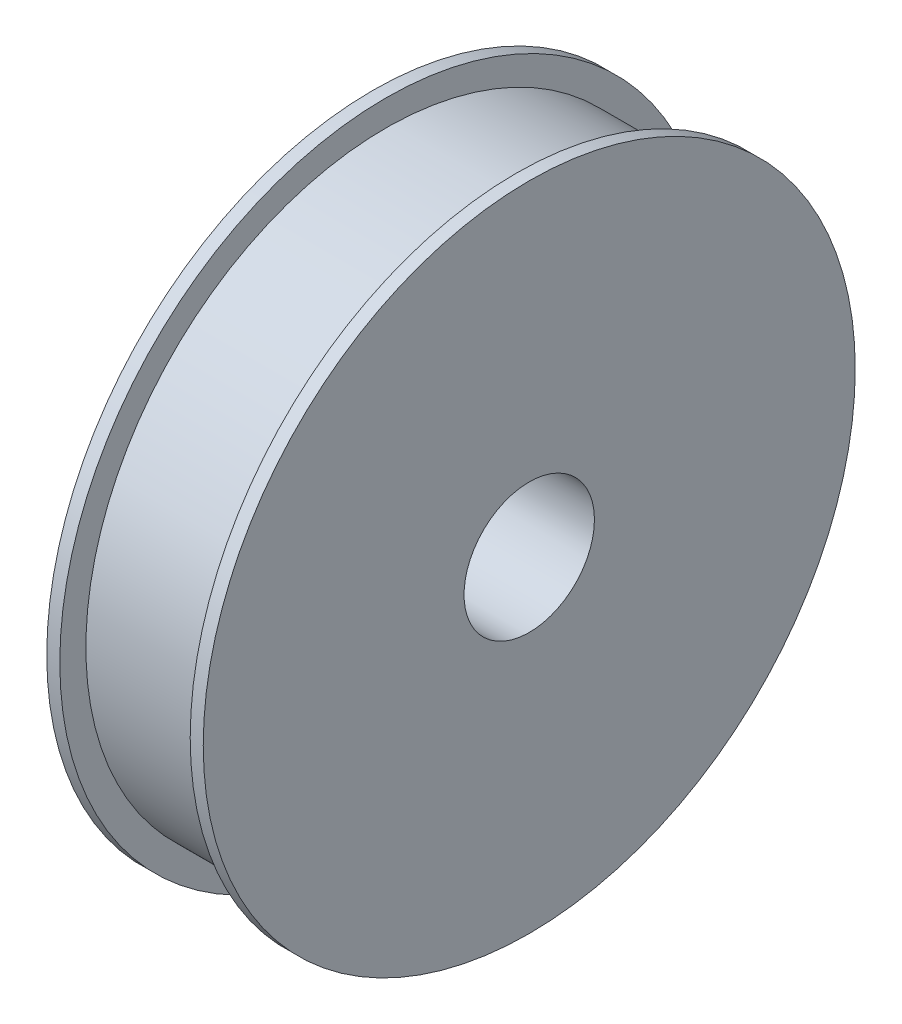
ISO-10303-21;
HEADER;
FILE_DESCRIPTION(('STEP AP214'),'2;1');
FILE_NAME('part.step','',(''),(''),'','','');
FILE_SCHEMA(('AUTOMOTIVE_DESIGN { 1 0 10303 214 1 1 1 1 }'));
ENDSEC;
DATA;
#1=APPLICATION_CONTEXT('core data for automotive mechanical design processes');
#2=APPLICATION_PROTOCOL_DEFINITION('international standard','automotive_design',2000,#1);
#3=PRODUCT_CONTEXT('',#1,'mechanical');
#4=PRODUCT('Part','Part','',(#3));
#5=PRODUCT_RELATED_PRODUCT_CATEGORY('part','',(#4));
#6=PRODUCT_DEFINITION_FORMATION('','',#4);
#7=PRODUCT_DEFINITION_CONTEXT('part definition',#1,'design');
#8=PRODUCT_DEFINITION('design','',#6,#7);
#9=PRODUCT_DEFINITION_SHAPE('','',#8);
#10=(LENGTH_UNIT() NAMED_UNIT(*) SI_UNIT(.MILLI.,.METRE.));
#11=(NAMED_UNIT(*) PLANE_ANGLE_UNIT() SI_UNIT($,.RADIAN.));
#12=(NAMED_UNIT(*) SI_UNIT($,.STERADIAN.) SOLID_ANGLE_UNIT());
#13=UNCERTAINTY_MEASURE_WITH_UNIT(LENGTH_MEASURE(1.E-05),#10,'distance_accuracy_value','');
#14=(GEOMETRIC_REPRESENTATION_CONTEXT(3) GLOBAL_UNCERTAINTY_ASSIGNED_CONTEXT((#13)) GLOBAL_UNIT_ASSIGNED_CONTEXT((#10,
#11,#12)) REPRESENTATION_CONTEXT('',''));
#15=CARTESIAN_POINT('',(0.,0.,0.));
#16=DIRECTION('',(0.,0.,1.));
#17=DIRECTION('',(1.,0.,0.));
#18=AXIS2_PLACEMENT_3D('',#15,#16,#17);
#19=CARTESIAN_POINT('',(18.,0.,0.));
#20=DIRECTION('',(1.,0.,0.));
#21=DIRECTION('',(0.,0.,-1.));
#22=AXIS2_PLACEMENT_3D('',#19,#20,#21);
#23=CYLINDRICAL_SURFACE('',#22,25.);
#24=CARTESIAN_POINT('',(6.,0.,0.));
#25=DIRECTION('',(1.,0.,0.));
#26=DIRECTION('',(0.,0.,-1.));
#27=AXIS2_PLACEMENT_3D('',#24,#25,#26);
#28=CIRCLE('',#27,25.);
#29=CARTESIAN_POINT('',(6.,0.,-25.));
#30=VERTEX_POINT('',#29);
#31=EDGE_CURVE('E172',#30,#30,#28,.F.);
#32=ORIENTED_EDGE('',*,*,#31,.F.);
#33=EDGE_LOOP('',(#32));
#34=FACE_BOUND('',#33,.T.);
#35=CARTESIAN_POINT('',(7.,0.,0.));
#36=DIRECTION('',(1.,0.,0.));
#37=DIRECTION('',(0.,0.,-1.));
#38=AXIS2_PLACEMENT_3D('',#35,#36,#37);
#39=CIRCLE('',#38,25.);
#40=CARTESIAN_POINT('',(7.,0.,-25.));
#41=VERTEX_POINT('',#40);
#42=EDGE_CURVE('E18',#41,#41,#39,.T.);
#43=ORIENTED_EDGE('',*,*,#42,.F.);
#44=EDGE_LOOP('',(#43));
#45=FACE_BOUND('',#44,.T.);
#46=ADVANCED_FACE('F15',(#34,#45),#23,.T.);
#47=CARTESIAN_POINT('',(7.,25.,0.));
#48=DIRECTION('',(1.,0.,0.));
#49=DIRECTION('',(0.,0.,-1.));
#50=AXIS2_PLACEMENT_3D('',#47,#48,#49);
#51=PLANE('',#50);
#52=CARTESIAN_POINT('',(7.,0.,0.));
#53=DIRECTION('',(1.,0.,0.));
#54=DIRECTION('',(0.,0.,-1.));
#55=AXIS2_PLACEMENT_3D('',#52,#53,#54);
#56=CIRCLE('',#55,23.);
#57=CARTESIAN_POINT('',(7.,0.,-23.));
#58=VERTEX_POINT('',#57);
#59=EDGE_CURVE('E176',#58,#58,#56,.T.);
#60=ORIENTED_EDGE('',*,*,#59,.F.);
#61=EDGE_LOOP('',(#60));
#62=FACE_BOUND('',#61,.T.);
#63=ORIENTED_EDGE('',*,*,#42,.T.);
#64=EDGE_LOOP('',(#63));
#65=FACE_BOUND('',#64,.T.);
#66=ADVANCED_FACE('F146',(#62,#65),#51,.T.);
#67=CARTESIAN_POINT('',(6.,10.,0.));
#68=DIRECTION('',(-1.,0.,0.));
#69=DIRECTION('',(0.,0.,1.));
#70=AXIS2_PLACEMENT_3D('',#67,#68,#69);
#71=PLANE('',#70);
#72=ORIENTED_EDGE('',*,*,#31,.T.);
#73=EDGE_LOOP('',(#72));
#74=FACE_BOUND('',#73,.T.);
#75=CARTESIAN_POINT('',(6.,0.,0.));
#76=DIRECTION('',(1.,0.,0.));
#77=DIRECTION('',(0.,0.,-1.));
#78=AXIS2_PLACEMENT_3D('',#75,#76,#77);
#79=CIRCLE('',#78,10.);
#80=CARTESIAN_POINT('',(6.,0.,-10.));
#81=VERTEX_POINT('',#80);
#82=EDGE_CURVE('E178',#81,#81,#79,.F.);
#83=ORIENTED_EDGE('',*,*,#82,.F.);
#84=EDGE_LOOP('',(#83));
#85=FACE_BOUND('',#84,.T.);
#86=ADVANCED_FACE('F136',(#74,#85),#71,.T.);
#87=CARTESIAN_POINT('',(18.,0.,0.));
#88=DIRECTION('',(1.,0.,0.));
#89=DIRECTION('',(0.,0.,-1.));
#90=AXIS2_PLACEMENT_3D('',#87,#88,#89);
#91=CYLINDRICAL_SURFACE('',#90,23.);
#92=ORIENTED_EDGE('',*,*,#59,.T.);
#93=EDGE_LOOP('',(#92));
#94=FACE_BOUND('',#93,.T.);
#95=CARTESIAN_POINT('',(17.,0.,0.));
#96=DIRECTION('',(1.,0.,0.));
#97=DIRECTION('',(0.,0.,-1.));
#98=AXIS2_PLACEMENT_3D('',#95,#96,#97);
#99=CIRCLE('',#98,23.);
#100=CARTESIAN_POINT('',(17.,0.,-23.));
#101=VERTEX_POINT('',#100);
#102=EDGE_CURVE('E183',#101,#101,#99,.T.);
#103=ORIENTED_EDGE('',*,*,#102,.F.);
#104=EDGE_LOOP('',(#103));
#105=FACE_BOUND('',#104,.T.);
#106=ADVANCED_FACE('F126',(#94,#105),#91,.T.);
#107=CARTESIAN_POINT('',(18.,0.,0.));
#108=DIRECTION('',(1.,0.,0.));
#109=DIRECTION('',(0.,0.,-1.));
#110=AXIS2_PLACEMENT_3D('',#107,#108,#109);
#111=CYLINDRICAL_SURFACE('',#110,10.);
#112=CARTESIAN_POINT('',(0.,0.,0.));
#113=DIRECTION('',(1.,0.,0.));
#114=DIRECTION('',(0.,0.,-1.));
#115=AXIS2_PLACEMENT_3D('',#112,#113,#114);
#116=CIRCLE('',#115,10.);
#117=CARTESIAN_POINT('',(0.,0.,-10.));
#118=VERTEX_POINT('',#117);
#119=EDGE_CURVE('E200',#118,#118,#116,.F.);
#120=ORIENTED_EDGE('',*,*,#119,.F.);
#121=EDGE_LOOP('',(#120));
#122=FACE_BOUND('',#121,.T.);
#123=CARTESIAN_POINT('',(3.,-7.6107094426595,-6.48668650232255));
#124=CARTESIAN_POINT('',(3.09191207261619,-7.61070737338895,-6.4866906171636));
#125=CARTESIAN_POINT('',(3.18394162874946,-7.60564328536761,-6.4926451064222));
#126=CARTESIAN_POINT('',(3.36548829058131,-7.58544728393344,-6.51622753022773));
#127=CARTESIAN_POINT('',(3.45499989813022,-7.57029488885876,-6.53387921251496));
#128=CARTESIAN_POINT('',(3.62875467587054,-7.5301845404463,-6.58006455054326));
#129=CARTESIAN_POINT('',(3.71300429845787,-7.50523888082746,-6.60858456170092));
#130=CARTESIAN_POINT('',(3.87399077064178,-7.445965963636,-6.67529565854484));
#131=CARTESIAN_POINT('',(3.95073040588339,-7.41164220269025,-6.71348313932422));
#132=CARTESIAN_POINT('',(4.0953054129355,-7.33384171773215,-6.79838956733881));
#133=CARTESIAN_POINT('',(4.16305697579763,-7.29028751545858,-6.8451802574938));
#134=CARTESIAN_POINT('',(4.28700631581203,-7.19498402307885,-6.94528414584731));
#135=CARTESIAN_POINT('',(4.34320281752596,-7.14323382942057,-6.99859806303954));
#136=CARTESIAN_POINT('',(4.4427518873531,-7.03222709351986,-7.1101335496477));
#137=CARTESIAN_POINT('',(4.48602772405625,-6.97292857825665,-7.16838189993056));
#138=CARTESIAN_POINT('',(4.55801334192307,-6.84838147828735,-7.28746080548884));
#139=CARTESIAN_POINT('',(4.586724177543,-6.78313332471831,-7.34829117348937));
#140=CARTESIAN_POINT('',(4.62851232822919,-6.64892307695652,-7.46993616875164));
#141=CARTESIAN_POINT('',(4.64172872738852,-6.57999992243994,-7.5307459597381));
#142=CARTESIAN_POINT('',(4.65258525618147,-6.43977884563567,-7.65099836793383));
#143=CARTESIAN_POINT('',(4.65022639848113,-6.36848107803957,-7.71044107377554));
#144=CARTESIAN_POINT('',(4.63010801514252,-6.22629528468234,-7.825697735011));
#145=CARTESIAN_POINT('',(4.61249829951111,-6.15541000554826,-7.88154132861692));
#146=CARTESIAN_POINT('',(4.56261364034299,-6.0155020463048,-7.98883673327135));
#147=CARTESIAN_POINT('',(4.53033813693551,-5.94647943740998,-8.04028837656678));
#148=CARTESIAN_POINT('',(4.45188752153465,-5.81215880976353,-8.13792001561393));
#149=CARTESIAN_POINT('',(4.40565009258496,-5.74687908430345,-8.1840750690429));
#150=CARTESIAN_POINT('',(4.30063758144345,-5.622509921932,-8.27001237542387));
#151=CARTESIAN_POINT('',(4.24186247305361,-5.56342049795591,-8.30979461505929));
#152=CARTESIAN_POINT('',(4.11262333918614,-5.45277253183398,-8.38282327229497));
#153=CARTESIAN_POINT('',(4.04203051717762,-5.40131026056838,-8.41598771566978));
#154=CARTESIAN_POINT('',(3.89155348222626,-5.3085889760726,-8.47478072010684));
#155=CARTESIAN_POINT('',(3.81166510849771,-5.2673345580152,-8.50040588826254));
#156=CARTESIAN_POINT('',(3.64469791953155,-5.19656277533974,-8.54385568654615));
#157=CARTESIAN_POINT('',(3.55760585891,-5.16706763895386,-8.56166554996228));
#158=CARTESIAN_POINT('',(3.37894726411673,-5.12116304157553,-8.5892035071003));
#159=CARTESIAN_POINT('',(3.28739062079285,-5.10472593529375,-8.59894867650401));
#160=CARTESIAN_POINT('',(3.16264363685023,-5.09176988820861,-8.60661881044247));
#161=CARTESIAN_POINT('',(3.13018823400373,-5.08924858698144,-8.60810970880728));
#162=CARTESIAN_POINT('',(3.06516014363887,-5.08588278463216,-8.61009872226581));
#163=CARTESIAN_POINT('',(3.03258745600735,-5.08503828512821,-8.61059683640146));
#164=CARTESIAN_POINT('',(2.90808792738381,-5.08504425707382,-8.61059503110882));
#165=CARTESIAN_POINT('',(2.81605837125054,-5.09177915651973,-8.60662740470603));
#166=CARTESIAN_POINT('',(2.63451170941869,-5.11847635989702,-8.59077595309099));
#167=CARTESIAN_POINT('',(2.54500010186978,-5.13846557289866,-8.57887602335827));
#168=CARTESIAN_POINT('',(2.37124532412946,-5.19084667476252,-8.54728257995484));
#169=CARTESIAN_POINT('',(2.28699570154213,-5.22322301248004,-8.52759883726568));
#170=CARTESIAN_POINT('',(2.12600922935822,-5.2991126887766,-8.48064773306026));
#171=CARTESIAN_POINT('',(2.04926959411661,-5.34262187608732,-8.45338319797719));
#172=CARTESIAN_POINT('',(1.9046945870645,-5.4396153158594,-8.3913002726346));
#173=CARTESIAN_POINT('',(1.83694302420237,-5.49318353808838,-8.35641785889797));
#174=CARTESIAN_POINT('',(1.71299368418797,-5.60815155701611,-8.27969824766916));
#175=CARTESIAN_POINT('',(1.65679718247404,-5.6695522170423,-8.23786028334968));
#176=CARTESIAN_POINT('',(1.5572481126469,-5.79847604829583,-8.14763109780997));
#177=CARTESIAN_POINT('',(1.51397227594375,-5.86603280327888,-8.09920311954063));
#178=CARTESIAN_POINT('',(1.44198665807693,-6.00471088883833,-7.99692822308364));
#179=CARTESIAN_POINT('',(1.413275822457,-6.07583196096062,-7.94308169751862));
#180=CARTESIAN_POINT('',(1.37148767177081,-6.2186956677781,-7.83172705347083));
#181=CARTESIAN_POINT('',(1.35827127261148,-6.29042685837201,-7.7742564679134));
#182=CARTESIAN_POINT('',(1.34741474381853,-6.43294968522202,-7.6567412098245));
#183=CARTESIAN_POINT('',(1.34977360151887,-6.50374138226187,-7.59669670489532));
#184=CARTESIAN_POINT('',(1.36989198485748,-6.64167952602322,-7.47638890677965));
#185=CARTESIAN_POINT('',(1.38750170048889,-6.70885470051914,-7.4161334034942));
#186=CARTESIAN_POINT('',(1.43738635965701,-6.83855886115174,-7.2967040451512));
#187=CARTESIAN_POINT('',(1.46966186306449,-6.901087669806,-7.23753023147719));
#188=CARTESIAN_POINT('',(1.54811247846535,-7.02031287882677,-7.12194771771182));
#189=CARTESIAN_POINT('',(1.59434990741504,-7.07698156862824,-7.06555276129407));
#190=CARTESIAN_POINT('',(1.69936241855655,-7.18297875518455,-6.95776822799202));
#191=CARTESIAN_POINT('',(1.75813752694639,-7.23230723660133,-6.90637866156703));
#192=CARTESIAN_POINT('',(1.88737666081386,-7.32323344274595,-6.8098976674764));
#193=CARTESIAN_POINT('',(1.95796948282238,-7.36473389446037,-6.76488702233913));
#194=CARTESIAN_POINT('',(2.10844651777374,-7.4385603982766,-6.6836250921162));
#195=CARTESIAN_POINT('',(2.18833489150229,-7.47088231952931,-6.64737775209247));
#196=CARTESIAN_POINT('',(2.35530208046845,-7.52582793015333,-6.58510809602225));
#197=CARTESIAN_POINT('',(2.44239414109,-7.54843325876909,-6.55910514573778));
#198=CARTESIAN_POINT('',(2.62105273588327,-7.58343728527461,-6.51860466089868));
#199=CARTESIAN_POINT('',(2.71260937920715,-7.59585754788028,-6.50408281988482));
#200=CARTESIAN_POINT('',(2.83735636314977,-7.60563640832542,-6.49263450127026));
#201=CARTESIAN_POINT('',(2.86981176599627,-7.60753769955203,-6.49040631153778));
#202=CARTESIAN_POINT('',(2.93483985636113,-7.61007458416007,-6.48743158188987));
#203=CARTESIAN_POINT('',(2.96741254399265,-7.61071017632007,-6.48668504340428));
#204=CARTESIAN_POINT('',(3.,-7.6107094426595,-6.48668650232255));
#205=B_SPLINE_CURVE_WITH_KNOTS('',3,(#123,#124,#125,#126,#127,#128,#129,#130,#131,#132,#133,
#134,#135,#136,#137,#138,#139,#140,#141,#142,#143,#144,#145,#146,#147,#148,#149,#150,#151,#152,
#153,#154,#155,#156,#157,#158,#159,#160,#161,#162,#163,#164,#165,#166,#167,#168,#169,#170,#171,
#172,#173,#174,#175,#176,#177,#178,#179,#180,#181,#182,#183,#184,#185,#186,#187,#188,#189,#190,
#191,#192,#193,#194,#195,#196,#197,#198,#199,#200,#201,#202,#203,#204),.UNSPECIFIED.,.T.,.F.,(4,
2,2,2,2,2,2,2,2,2,2,2,2,2,2,2,2,2,2,2,2,2,2,2,2,2,2,2,2,2,2,2,2,2,2,2,2,2,2,2,4),(0.,
0.275611787158917,0.551784845046081,0.827612319197246,1.10333709103337,1.38147502679861,
1.65964364674415,1.93943277847992,2.21920165154795,2.49643950072986,2.77365932474558,
3.04818649863057,3.32272415355211,3.59850574755901,3.87428791782914,4.15329893025649,
4.43243531486017,4.71209686930941,4.99116475970074,5.08888291648003,5.18660116755956,
5.46221295471848,5.73838601260565,6.01421348675681,6.28993825859293,6.56807619435817,
6.84624481430371,7.12603394603949,7.40580281910751,7.68304066828942,7.96026049230514,
8.23478766619013,8.50932532111167,8.78510691511857,9.0608890853887,9.33990009781605,
9.61903648241973,9.89869803686897,10.1777659272603,10.2754840840396,10.3732023351191),.UNSPECIFIED.);
#206=CARTESIAN_POINT('',(3.,-7.6107094426595,-6.48668650232255));
#207=VERTEX_POINT('',#206);
#208=EDGE_CURVE('E191',#207,#207,#205,.T.);
#209=ORIENTED_EDGE('',*,*,#208,.T.);
#210=EDGE_LOOP('',(#209));
#211=FACE_BOUND('',#210,.T.);
#212=ORIENTED_EDGE('',*,*,#82,.T.);
#213=EDGE_LOOP('',(#212));
#214=FACE_BOUND('',#213,.T.);
#215=CARTESIAN_POINT('',(3.,5.08503984827079,8.6105963638704));
#216=CARTESIAN_POINT('',(2.90808792738381,5.08504425707382,8.61059503110882));
#217=CARTESIAN_POINT('',(2.81605837125054,5.09177915651973,8.60662740470603));
#218=CARTESIAN_POINT('',(2.63451170941869,5.11847635989702,8.59077595309099));
#219=CARTESIAN_POINT('',(2.54500010186978,5.13846557289866,8.57887602335827));
#220=CARTESIAN_POINT('',(2.37124532412946,5.19084667476251,8.54728257995484));
#221=CARTESIAN_POINT('',(2.28699570154213,5.22322301248003,8.52759883726568));
#222=CARTESIAN_POINT('',(2.12600922935822,5.2991126887766,8.48064773306026));
#223=CARTESIAN_POINT('',(2.04926959411661,5.34262187608732,8.45338319797719));
#224=CARTESIAN_POINT('',(1.9046945870645,5.4396153158594,8.3913002726346));
#225=CARTESIAN_POINT('',(1.83694302420237,5.49318353808838,8.35641785889797));
#226=CARTESIAN_POINT('',(1.71299368418797,5.60815155701611,8.27969824766916));
#227=CARTESIAN_POINT('',(1.65679718247404,5.6695522170423,8.23786028334968));
#228=CARTESIAN_POINT('',(1.5572481126469,5.79847604829583,8.14763109780997));
#229=CARTESIAN_POINT('',(1.51397227594375,5.86603280327888,8.09920311954063));
#230=CARTESIAN_POINT('',(1.44198665807693,6.00471088883833,7.99692822308364));
#231=CARTESIAN_POINT('',(1.413275822457,6.07583196096062,7.94308169751862));
#232=CARTESIAN_POINT('',(1.37148767177081,6.2186956677781,7.83172705347084));
#233=CARTESIAN_POINT('',(1.35827127261148,6.29042685837201,7.7742564679134));
#234=CARTESIAN_POINT('',(1.34741474381853,6.43294968522202,7.6567412098245));
#235=CARTESIAN_POINT('',(1.34977360151887,6.50374138226187,7.59669670489532));
#236=CARTESIAN_POINT('',(1.36989198485749,6.64167952602322,7.47638890677965));
#237=CARTESIAN_POINT('',(1.3875017004889,6.70885470051913,7.4161334034942));
#238=CARTESIAN_POINT('',(1.43738635965701,6.83855886115174,7.2967040451512));
#239=CARTESIAN_POINT('',(1.46966186306449,6.90108766980599,7.23753023147719));
#240=CARTESIAN_POINT('',(1.54811247846535,7.02031287882677,7.12194771771182));
#241=CARTESIAN_POINT('',(1.59434990741504,7.07698156862824,7.06555276129407));
#242=CARTESIAN_POINT('',(1.69936241855655,7.18297875518454,6.95776822799202));
#243=CARTESIAN_POINT('',(1.75813752694639,7.23230723660133,6.90637866156702));
#244=CARTESIAN_POINT('',(1.88737666081386,7.32323344274595,6.8098976674764));
#245=CARTESIAN_POINT('',(1.95796948282238,7.36473389446037,6.76488702233913));
#246=CARTESIAN_POINT('',(2.10844651777374,7.4385603982766,6.6836250921162));
#247=CARTESIAN_POINT('',(2.18833489150229,7.47088231952931,6.64737775209247));
#248=CARTESIAN_POINT('',(2.35530208046845,7.52582793015333,6.58510809602225));
#249=CARTESIAN_POINT('',(2.44239414109,7.54843325876908,6.55910514573778));
#250=CARTESIAN_POINT('',(2.62105273588327,7.58343728527461,6.51860466089868));
#251=CARTESIAN_POINT('',(2.71260937920715,7.59585754788028,6.50408281988482));
#252=CARTESIAN_POINT('',(2.83735636314977,7.60563640832542,6.49263450127026));
#253=CARTESIAN_POINT('',(2.86981176599627,7.60753769955203,6.49040631153778));
#254=CARTESIAN_POINT('',(2.93483985636113,7.61007458416007,6.48743158188987));
#255=CARTESIAN_POINT('',(2.96741254399265,7.61071017632007,6.48668504340428));
#256=CARTESIAN_POINT('',(3.09191207261619,7.61070737338895,6.48669061716361));
#257=CARTESIAN_POINT('',(3.18394162874946,7.60564328536761,6.4926451064222));
#258=CARTESIAN_POINT('',(3.36548829058131,7.58544728393344,6.51622753022773));
#259=CARTESIAN_POINT('',(3.45499989813022,7.57029488885876,6.53387921251496));
#260=CARTESIAN_POINT('',(3.62875467587053,7.5301845404463,6.58006455054326));
#261=CARTESIAN_POINT('',(3.71300429845787,7.50523888082746,6.60858456170092));
#262=CARTESIAN_POINT('',(3.87399077064178,7.44596596363599,6.67529565854484));
#263=CARTESIAN_POINT('',(3.95073040588339,7.41164220269025,6.71348313932422));
#264=CARTESIAN_POINT('',(4.0953054129355,7.33384171773215,6.79838956733881));
#265=CARTESIAN_POINT('',(4.16305697579763,7.29028751545858,6.84518025749379));
#266=CARTESIAN_POINT('',(4.28700631581203,7.19498402307885,6.94528414584731));
#267=CARTESIAN_POINT('',(4.34320281752596,7.14323382942057,6.99859806303954));
#268=CARTESIAN_POINT('',(4.4427518873531,7.03222709351986,7.1101335496477));
#269=CARTESIAN_POINT('',(4.48602772405625,6.97292857825665,7.16838189993057));
#270=CARTESIAN_POINT('',(4.55801334192307,6.84838147828735,7.28746080548884));
#271=CARTESIAN_POINT('',(4.586724177543,6.78313332471831,7.34829117348937));
#272=CARTESIAN_POINT('',(4.62851232822919,6.64892307695652,7.46993616875165));
#273=CARTESIAN_POINT('',(4.64172872738852,6.57999992243993,7.5307459597381));
#274=CARTESIAN_POINT('',(4.65258525618147,6.43977884563567,7.65099836793383));
#275=CARTESIAN_POINT('',(4.65022639848113,6.36848107803957,7.71044107377554));
#276=CARTESIAN_POINT('',(4.63010801514252,6.22629528468234,7.825697735011));
#277=CARTESIAN_POINT('',(4.6124982995111,6.15541000554826,7.88154132861692));
#278=CARTESIAN_POINT('',(4.56261364034299,6.0155020463048,7.98883673327135));
#279=CARTESIAN_POINT('',(4.53033813693551,5.94647943740998,8.04028837656678));
#280=CARTESIAN_POINT('',(4.45188752153465,5.81215880976353,8.13792001561393));
#281=CARTESIAN_POINT('',(4.40565009258496,5.74687908430345,8.18407506904291));
#282=CARTESIAN_POINT('',(4.30063758144345,5.622509921932,8.27001237542387));
#283=CARTESIAN_POINT('',(4.24186247305361,5.56342049795591,8.30979461505929));
#284=CARTESIAN_POINT('',(4.11262333918614,5.45277253183398,8.38282327229497));
#285=CARTESIAN_POINT('',(4.04203051717762,5.40131026056838,8.41598771566978));
#286=CARTESIAN_POINT('',(3.89155348222626,5.3085889760726,8.47478072010684));
#287=CARTESIAN_POINT('',(3.81166510849771,5.2673345580152,8.50040588826254));
#288=CARTESIAN_POINT('',(3.64469791953155,5.19656277533974,8.54385568654615));
#289=CARTESIAN_POINT('',(3.55760585891,5.16706763895385,8.56166554996228));
#290=CARTESIAN_POINT('',(3.37894726411673,5.12116304157553,8.5892035071003));
#291=CARTESIAN_POINT('',(3.28739062079285,5.10472593529375,8.59894867650402));
#292=CARTESIAN_POINT('',(3.16264363685023,5.09176988820861,8.60661881044247));
#293=CARTESIAN_POINT('',(3.13018823400373,5.08924858698144,8.60810970880728));
#294=CARTESIAN_POINT('',(3.06516014363887,5.08588278463216,8.61009872226581));
#295=CARTESIAN_POINT('',(3.03258745600735,5.08503828512821,8.61059683640146));
#296=CARTESIAN_POINT('',(3.,5.08503984827079,8.6105963638704));
#297=B_SPLINE_CURVE_WITH_KNOTS('',3,(#215,#216,#217,#218,#219,#220,#221,#222,#223,#224,#225,
#226,#227,#228,#229,#230,#231,#232,#233,#234,#235,#236,#237,#238,#239,#240,#241,#242,#243,#244,
#245,#246,#247,#248,#249,#250,#251,#252,#253,#254,#255,#256,#257,#258,#259,#260,#261,#262,#263,
#264,#265,#266,#267,#268,#269,#270,#271,#272,#273,#274,#275,#276,#277,#278,#279,#280,#281,#282,
#283,#284,#285,#286,#287,#288,#289,#290,#291,#292,#293,#294,#295,#296),.UNSPECIFIED.,.T.,.F.,(4,
2,2,2,2,2,2,2,2,2,2,2,2,2,2,2,2,2,2,2,2,2,2,2,2,2,2,2,2,2,2,2,2,2,2,2,2,2,2,2,4),(0.,
0.275611787158917,0.55178484504608,0.827612319197245,1.10333709103337,1.38147502679861,
1.65964364674415,1.93943277847992,2.21920165154795,2.49643950072986,2.77365932474558,
3.04818649863057,3.32272415355211,3.59850574755901,3.87428791782914,4.15329893025648,
4.43243531486016,4.71209686930941,4.99116475970074,5.08888291648003,5.18660116755956,
5.46221295471848,5.73838601260564,6.01421348675681,6.28993825859293,6.56807619435817,
6.84624481430371,7.12603394603948,7.40580281910751,7.68304066828942,7.96026049230514,
8.23478766619013,8.50932532111167,8.78510691511856,9.0608890853887,9.33990009781604,
9.61903648241972,9.89869803686897,10.1777659272603,10.2754840840396,10.3732023351191),.UNSPECIFIED.);
#298=CARTESIAN_POINT('',(3.,5.08503984827079,8.6105963638704));
#299=VERTEX_POINT('',#298);
#300=EDGE_CURVE('E186',#299,#299,#297,.T.);
#301=ORIENTED_EDGE('',*,*,#300,.T.);
#302=EDGE_LOOP('',(#301));
#303=FACE_BOUND('',#302,.T.);
#304=ADVANCED_FACE('F116',(#122,#211,#214,#303),#111,.T.);
#305=CARTESIAN_POINT('',(17.,23.,0.));
#306=DIRECTION('',(-1.,0.,0.));
#307=DIRECTION('',(0.,0.,1.));
#308=AXIS2_PLACEMENT_3D('',#305,#306,#307);
#309=PLANE('',#308);
#310=CARTESIAN_POINT('',(17.,0.,0.));
#311=DIRECTION('',(1.,0.,0.));
#312=DIRECTION('',(0.,0.,-1.));
#313=AXIS2_PLACEMENT_3D('',#310,#311,#312);
#314=CIRCLE('',#313,25.);
#315=CARTESIAN_POINT('',(17.,0.,-25.));
#316=VERTEX_POINT('',#315);
#317=EDGE_CURVE('E201',#316,#316,#314,.T.);
#318=ORIENTED_EDGE('',*,*,#317,.F.);
#319=EDGE_LOOP('',(#318));
#320=FACE_BOUND('',#319,.T.);
#321=ORIENTED_EDGE('',*,*,#102,.T.);
#322=EDGE_LOOP('',(#321));
#323=FACE_BOUND('',#322,.T.);
#324=ADVANCED_FACE('F107',(#320,#323),#309,.T.);
#325=CARTESIAN_POINT('',(3.,6.436090489539,7.65354422542038));
#326=DIRECTION('',(0.,0.6436090489539,0.765354422542038));
#327=DIRECTION('',(0.,-0.765354422542038,0.6436090489539));
#328=AXIS2_PLACEMENT_3D('',#325,#326,#327);
#329=CYLINDRICAL_SURFACE('',#328,1.64999999999999);
#330=ORIENTED_EDGE('',*,*,#300,.F.);
#331=EDGE_LOOP('',(#330));
#332=FACE_BOUND('',#331,.T.);
#333=CARTESIAN_POINT('',(3.,1.77493855221612,4.67435483632308));
#334=CARTESIAN_POINT('',(2.910194556091,1.77494530685132,4.6743548429974));
#335=CARTESIAN_POINT('',(2.82029507792679,1.78224735240646,4.67159977024718));
#336=CARTESIAN_POINT('',(2.64306551352795,1.8110580940114,4.66050374009999));
#337=CARTESIAN_POINT('',(2.55574008991332,1.83259109207492,4.65215322710253));
#338=CARTESIAN_POINT('',(2.38639090057449,1.8886063547841,4.62969408915627));
#339=CARTESIAN_POINT('',(2.30435428416619,1.92305572949092,4.6156000814456));
#340=CARTESIAN_POINT('',(2.14739402020458,2.0032231386096,4.5813741086495));
#341=CARTESIAN_POINT('',(2.07246967572266,2.04894006733634,4.56124273596872));
#342=CARTESIAN_POINT('',(1.92894453849603,2.15149172665812,4.51379864077562));
#343=CARTESIAN_POINT('',(1.86065609332172,2.20865905714074,4.48625961094405));
#344=CARTESIAN_POINT('',(1.73514357962444,2.3307620489174,4.42405216925326));
#345=CARTESIAN_POINT('',(1.6779218143414,2.39569932277959,4.38938227638297));
#346=CARTESIAN_POINT('',(1.57476631361247,2.53270690416636,4.31181393315642));
#347=CARTESIAN_POINT('',(1.52915749347003,2.6049168414842,4.26872826140311));
#348=CARTESIAN_POINT('',(1.4526711202512,2.75232027817258,4.17520509058748));
#349=CARTESIAN_POINT('',(1.42178961489175,2.8275129712045,4.12476956871022));
#350=CARTESIAN_POINT('',(1.37668693265613,2.97553396874661,4.01922553784355));
#351=CARTESIAN_POINT('',(1.36193278910186,3.04835531977826,3.96433544779196));
#352=CARTESIAN_POINT('',(1.34781000113864,3.19173393857012,3.84983668059404));
#353=CARTESIAN_POINT('',(1.3484374724872,3.26229177341846,3.79022919849689));
#354=CARTESIAN_POINT('',(1.36471995618388,3.39633819367059,3.67051195869874));
#355=CARTESIAN_POINT('',(1.37979619539875,3.45999428281731,3.6105096496685));
#356=CARTESIAN_POINT('',(1.4235924862808,3.58169764559091,3.48981251110012));
#357=CARTESIAN_POINT('',(1.45231351560827,3.6397445169541,3.42911763224297));
#358=CARTESIAN_POINT('',(1.52292829491767,3.74989433262348,3.30833284691946));
#359=CARTESIAN_POINT('',(1.56498882745622,3.80190996133363,3.24826113129348));
#360=CARTESIAN_POINT('',(1.66094960489657,3.8984911825538,3.13169358867808));
#361=CARTESIAN_POINT('',(1.71485247252708,3.9430551208773,3.07519855739497));
#362=CARTESIAN_POINT('',(1.83588432447663,4.02631332609362,2.96542860925378));
#363=CARTESIAN_POINT('',(1.90350806924852,4.06464278698428,2.9124217865896));
#364=CARTESIAN_POINT('',(2.04860129039347,4.13273002243788,2.81497544432921));
#365=CARTESIAN_POINT('',(2.12607555560375,4.16248360469242,2.7705401183979));
#366=CARTESIAN_POINT('',(2.29010127537031,4.21374919319328,2.69194327186493));
#367=CARTESIAN_POINT('',(2.37676757004028,4.23513609356744,2.65793923512436));
#368=CARTESIAN_POINT('',(2.55572410017677,4.26900607289003,2.60319808816362));
#369=CARTESIAN_POINT('',(2.6480019532225,4.28150803499118,2.5824328512635));
#370=CARTESIAN_POINT('',(2.78428531100224,4.29325428914947,2.56281252577287));
#371=CARTESIAN_POINT('',(2.8272439275302,4.29601098159162,2.55818348073297));
#372=CARTESIAN_POINT('',(2.91346108154123,4.29968819249316,2.55199809380471));
#373=CARTESIAN_POINT('',(2.95671962051295,4.30060870183217,2.55044176717866));
#374=CARTESIAN_POINT('',(3.089805443909,4.30060699452533,2.55045163043853));
#375=CARTESIAN_POINT('',(3.17970492207321,4.29664020247847,2.55717285473217));
#376=CARTESIAN_POINT('',(3.35693448647205,4.28076659263575,2.58365321023233));
#377=CARTESIAN_POINT('',(3.44425991008668,4.26884619223122,2.60343464413183));
#378=CARTESIAN_POINT('',(3.61360909942551,4.23711137618875,2.65476712882152));
#379=CARTESIAN_POINT('',(3.69564571583381,4.21731700290173,2.68628828453024));
#380=CARTESIAN_POINT('',(3.85260597979542,4.16984682605982,2.75939651258454));
#381=CARTESIAN_POINT('',(3.92753032427734,4.14217179579246,2.80098259725139));
#382=CARTESIAN_POINT('',(4.07105546150397,4.07783973718935,2.89387592981207));
#383=CARTESIAN_POINT('',(4.13934390667828,4.04090270339702,2.94547202824206));
#384=CARTESIAN_POINT('',(4.26485642037556,3.95867238607935,3.05509447720376));
#385=CARTESIAN_POINT('',(4.3220781856586,3.91337736688288,3.11312216235733));
#386=CARTESIAN_POINT('',(4.42523368638753,3.81345717076627,3.23479335712578));
#387=CARTESIAN_POINT('',(4.47084250652997,3.75862359606619,3.29854231196813));
#388=CARTESIAN_POINT('',(4.5473288797488,3.64120180299793,3.42771846742876));
#389=CARTESIAN_POINT('',(4.57821038510825,3.57861567082423,3.49314521281594));
#390=CARTESIAN_POINT('',(4.62331306734387,3.44924525695536,3.62086778004799));
#391=CARTESIAN_POINT('',(4.63806721089814,3.38267734956997,3.68319421792371));
#392=CARTESIAN_POINT('',(4.65218999886136,3.2452812553357,3.80480716668196));
#393=CARTESIAN_POINT('',(4.6515625275128,3.17445414854775,3.86409444123977));
#394=CARTESIAN_POINT('',(4.63528004381612,3.03351772624282,3.97561836313632));
#395=CARTESIAN_POINT('',(4.62020380460125,2.9634855340809,4.02803846267276));
#396=CARTESIAN_POINT('',(4.5764075137192,2.82370100070365,4.12723418837454));
#397=CARTESIAN_POINT('',(4.54768648439173,2.75394867990254,4.17400940977858));
#398=CARTESIAN_POINT('',(4.47707170508233,2.61605963407412,4.26180779984456));
#399=CARTESIAN_POINT('',(4.43501117254378,2.54795580792566,4.30274806745849));
#400=CARTESIAN_POINT('',(4.33905039510343,2.41654898302476,4.37790237973155));
#401=CARTESIAN_POINT('',(4.28514752747292,2.35324705193524,4.4121149312137));
#402=CARTESIAN_POINT('',(4.16411567552337,2.2308224286736,4.47530972427459));
#403=CARTESIAN_POINT('',(4.09649193075148,2.17202643393926,4.50397855446207));
#404=CARTESIAN_POINT('',(3.95139870960653,2.06434510588538,4.5543411679784));
#405=CARTESIAN_POINT('',(3.87392444439625,2.01546462319924,4.5760315404964));
#406=CARTESIAN_POINT('',(3.70989872462969,1.92923890243374,4.61305518061644));
#407=CARTESIAN_POINT('',(3.62323242995972,1.89207027400856,4.62829221061768));
#408=CARTESIAN_POINT('',(3.44427589982323,1.83233061722983,4.65227016044349));
#409=CARTESIAN_POINT('',(3.3519980467775,1.80972863997065,4.6610248588319));
#410=CARTESIAN_POINT('',(3.21571468899776,1.78838423451624,4.66923144246378));
#411=CARTESIAN_POINT('',(3.1727560724698,1.78335093224241,4.671153233145));
#412=CARTESIAN_POINT('',(3.08653891845877,1.77662645514479,4.67371493164995));
#413=CARTESIAN_POINT('',(3.04328037948705,1.77493529692154,4.67435483310649));
#414=CARTESIAN_POINT('',(3.,1.77493855221612,4.67435483632308));
#415=B_SPLINE_CURVE_WITH_KNOTS('',3,(#333,#334,#335,#336,#337,#338,#339,#340,#341,#342,#343,
#344,#345,#346,#347,#348,#349,#350,#351,#352,#353,#354,#355,#356,#357,#358,#359,#360,#361,#362,
#363,#364,#365,#366,#367,#368,#369,#370,#371,#372,#373,#374,#375,#376,#377,#378,#379,#380,#381,
#382,#383,#384,#385,#386,#387,#388,#389,#390,#391,#392,#393,#394,#395,#396,#397,#398,#399,#400,
#401,#402,#403,#404,#405,#406,#407,#408,#409,#410,#411,#412,#413,#414),.UNSPECIFIED.,.T.,.F.,(4,
2,2,2,2,2,2,2,2,2,2,2,2,2,2,2,2,2,2,2,2,2,2,2,2,2,2,2,2,2,2,2,2,2,2,2,2,2,2,2,4),(0.,
0.269248264263083,0.538957512500616,0.807984593304161,1.07698528498305,1.35538334262077,
1.63383927932585,1.91939313915637,2.20487032338912,2.48059785031906,2.75625574986924,
3.02131393530011,3.28639111523022,3.55492264101409,3.82351369868787,4.10447351550753,
4.38557044716408,4.67072312856859,4.95526794800395,5.08502744436715,5.21478758524841,
5.48403584951149,5.75374509774902,6.02277217855257,6.29177287023146,6.57017092786918,
6.84862686457426,7.13418072440478,7.41965790863753,7.69538543556746,7.97104333511765,
8.23610152054852,8.50117870047863,8.7697102262625,9.03830128393628,9.31926110075594,
9.60035803241249,9.88551071381701,10.1700555332524,10.2998150296156,10.4295751704968),.UNSPECIFIED.);
#416=CARTESIAN_POINT('',(3.,1.77493855221612,4.67435483632308));
#417=VERTEX_POINT('',#416);
#418=EDGE_CURVE('E39',#417,#417,#415,.T.);
#419=ORIENTED_EDGE('',*,*,#418,.T.);
#420=EDGE_LOOP('',(#419));
#421=FACE_BOUND('',#420,.T.);
#422=ADVANCED_FACE('F65',(#332,#421),#329,.F.);
#423=CARTESIAN_POINT('',(3.,6.436090489539,7.65354422542038));
#424=DIRECTION('',(0.,0.6436090489539,0.765354422542038));
#425=DIRECTION('',(0.,-0.765354422542038,0.6436090489539));
#426=AXIS2_PLACEMENT_3D('',#423,#424,#425);
#427=CYLINDRICAL_SURFACE('',#426,1.64999999999999);
#428=ORIENTED_EDGE('',*,*,#208,.F.);
#429=EDGE_LOOP('',(#428));
#430=FACE_BOUND('',#429,.T.);
#431=CARTESIAN_POINT('',(3.,-4.30060814660483,-2.55044497477522));
#432=CARTESIAN_POINT('',(3.089805443909,-4.30060699452533,-2.55045163043853));
#433=CARTESIAN_POINT('',(3.17970492207321,-4.29664020247847,-2.55717285473217));
#434=CARTESIAN_POINT('',(3.35693448647205,-4.28076659263575,-2.58365321023233));
#435=CARTESIAN_POINT('',(3.44425991008668,-4.26884619223122,-2.60343464413183));
#436=CARTESIAN_POINT('',(3.61360909942551,-4.23711137618875,-2.65476712882152));
#437=CARTESIAN_POINT('',(3.69564571583381,-4.21731700290173,-2.68628828453024));
#438=CARTESIAN_POINT('',(3.85260597979542,-4.16984682605982,-2.75939651258453));
#439=CARTESIAN_POINT('',(3.92753032427734,-4.14217179579246,-2.80098259725139));
#440=CARTESIAN_POINT('',(4.07105546150397,-4.07783973718935,-2.89387592981207));
#441=CARTESIAN_POINT('',(4.13934390667828,-4.04090270339702,-2.94547202824206));
#442=CARTESIAN_POINT('',(4.26485642037556,-3.95867238607935,-3.05509447720376));
#443=CARTESIAN_POINT('',(4.3220781856586,-3.91337736688288,-3.11312216235733));
#444=CARTESIAN_POINT('',(4.42523368638753,-3.81345717076627,-3.23479335712578));
#445=CARTESIAN_POINT('',(4.47084250652997,-3.75862359606619,-3.29854231196813));
#446=CARTESIAN_POINT('',(4.5473288797488,-3.64120180299793,-3.42771846742876));
#447=CARTESIAN_POINT('',(4.57821038510825,-3.57861567082423,-3.49314521281594));
#448=CARTESIAN_POINT('',(4.62331306734387,-3.44924525695536,-3.62086778004799));
#449=CARTESIAN_POINT('',(4.63806721089814,-3.38267734956997,-3.68319421792371));
#450=CARTESIAN_POINT('',(4.65218999886136,-3.2452812553357,-3.80480716668196));
#451=CARTESIAN_POINT('',(4.6515625275128,-3.17445414854775,-3.86409444123977));
#452=CARTESIAN_POINT('',(4.63528004381612,-3.03351772624282,-3.97561836313632));
#453=CARTESIAN_POINT('',(4.62020380460125,-2.9634855340809,-4.02803846267276));
#454=CARTESIAN_POINT('',(4.5764075137192,-2.82370100070365,-4.12723418837454));
#455=CARTESIAN_POINT('',(4.54768648439173,-2.75394867990254,-4.17400940977858));
#456=CARTESIAN_POINT('',(4.47707170508233,-2.61605963407412,-4.26180779984456));
#457=CARTESIAN_POINT('',(4.43501117254378,-2.54795580792566,-4.30274806745849));
#458=CARTESIAN_POINT('',(4.33905039510343,-2.41654898302476,-4.37790237973155));
#459=CARTESIAN_POINT('',(4.28514752747292,-2.35324705193524,-4.4121149312137));
#460=CARTESIAN_POINT('',(4.16411567552337,-2.23082242867361,-4.47530972427459));
#461=CARTESIAN_POINT('',(4.09649193075148,-2.17202643393926,-4.50397855446207));
#462=CARTESIAN_POINT('',(3.95139870960653,-2.06434510588538,-4.5543411679784));
#463=CARTESIAN_POINT('',(3.87392444439625,-2.01546462319924,-4.5760315404964));
#464=CARTESIAN_POINT('',(3.70989872462969,-1.92923890243374,-4.61305518061644));
#465=CARTESIAN_POINT('',(3.62323242995972,-1.89207027400856,-4.62829221061768));
#466=CARTESIAN_POINT('',(3.44427589982323,-1.83233061722983,-4.65227016044349));
#467=CARTESIAN_POINT('',(3.3519980467775,-1.80972863997065,-4.6610248588319));
#468=CARTESIAN_POINT('',(3.21571468899776,-1.78838423451624,-4.66923144246378));
#469=CARTESIAN_POINT('',(3.1727560724698,-1.78335093224241,-4.671153233145));
#470=CARTESIAN_POINT('',(3.08653891845877,-1.77662645514479,-4.67371493164995));
#471=CARTESIAN_POINT('',(3.04328037948705,-1.77493529692154,-4.67435483310649));
#472=CARTESIAN_POINT('',(2.910194556091,-1.77494530685132,-4.6743548429974));
#473=CARTESIAN_POINT('',(2.82029507792679,-1.78224735240646,-4.67159977024718));
#474=CARTESIAN_POINT('',(2.64306551352795,-1.8110580940114,-4.66050374009999));
#475=CARTESIAN_POINT('',(2.55574008991332,-1.83259109207492,-4.65215322710253));
#476=CARTESIAN_POINT('',(2.38639090057449,-1.8886063547841,-4.62969408915627));
#477=CARTESIAN_POINT('',(2.30435428416619,-1.92305572949092,-4.61560008144559));
#478=CARTESIAN_POINT('',(2.14739402020458,-2.0032231386096,-4.5813741086495));
#479=CARTESIAN_POINT('',(2.07246967572267,-2.04894006733634,-4.56124273596872));
#480=CARTESIAN_POINT('',(1.92894453849603,-2.15149172665812,-4.51379864077562));
#481=CARTESIAN_POINT('',(1.86065609332172,-2.20865905714075,-4.48625961094405));
#482=CARTESIAN_POINT('',(1.73514357962444,-2.3307620489174,-4.42405216925326));
#483=CARTESIAN_POINT('',(1.6779218143414,-2.39569932277959,-4.38938227638297));
#484=CARTESIAN_POINT('',(1.57476631361247,-2.53270690416636,-4.31181393315642));
#485=CARTESIAN_POINT('',(1.52915749347003,-2.6049168414842,-4.26872826140311));
#486=CARTESIAN_POINT('',(1.4526711202512,-2.75232027817258,-4.17520509058748));
#487=CARTESIAN_POINT('',(1.42178961489175,-2.8275129712045,-4.12476956871022));
#488=CARTESIAN_POINT('',(1.37668693265613,-2.97553396874661,-4.01922553784355));
#489=CARTESIAN_POINT('',(1.36193278910186,-3.04835531977826,-3.96433544779196));
#490=CARTESIAN_POINT('',(1.34781000113864,-3.19173393857012,-3.84983668059404));
#491=CARTESIAN_POINT('',(1.3484374724872,-3.26229177341846,-3.79022919849689));
#492=CARTESIAN_POINT('',(1.36471995618388,-3.39633819367059,-3.67051195869874));
#493=CARTESIAN_POINT('',(1.37979619539875,-3.45999428281731,-3.6105096496685));
#494=CARTESIAN_POINT('',(1.4235924862808,-3.58169764559092,-3.48981251110012));
#495=CARTESIAN_POINT('',(1.45231351560827,-3.6397445169541,-3.42911763224297));
#496=CARTESIAN_POINT('',(1.52292829491767,-3.74989433262349,-3.30833284691946));
#497=CARTESIAN_POINT('',(1.56498882745622,-3.80190996133363,-3.24826113129348));
#498=CARTESIAN_POINT('',(1.66094960489657,-3.8984911825538,-3.13169358867808));
#499=CARTESIAN_POINT('',(1.71485247252708,-3.9430551208773,-3.07519855739497));
#500=CARTESIAN_POINT('',(1.83588432447663,-4.02631332609362,-2.96542860925378));
#501=CARTESIAN_POINT('',(1.90350806924852,-4.06464278698428,-2.9124217865896));
#502=CARTESIAN_POINT('',(2.04860129039347,-4.13273002243788,-2.81497544432921));
#503=CARTESIAN_POINT('',(2.12607555560375,-4.16248360469242,-2.7705401183979));
#504=CARTESIAN_POINT('',(2.29010127537031,-4.21374919319328,-2.69194327186493));
#505=CARTESIAN_POINT('',(2.37676757004028,-4.23513609356744,-2.65793923512436));
#506=CARTESIAN_POINT('',(2.55572410017677,-4.26900607289003,-2.60319808816362));
#507=CARTESIAN_POINT('',(2.6480019532225,-4.28150803499118,-2.5824328512635));
#508=CARTESIAN_POINT('',(2.78428531100224,-4.29325428914947,-2.56281252577287));
#509=CARTESIAN_POINT('',(2.8272439275302,-4.29601098159162,-2.55818348073297));
#510=CARTESIAN_POINT('',(2.91346108154123,-4.29968819249317,-2.55199809380471));
#511=CARTESIAN_POINT('',(2.95671962051295,-4.30060870183217,-2.55044176717866));
#512=CARTESIAN_POINT('',(3.,-4.30060814660483,-2.55044497477522));
#513=B_SPLINE_CURVE_WITH_KNOTS('',3,(#431,#432,#433,#434,#435,#436,#437,#438,#439,#440,#441,
#442,#443,#444,#445,#446,#447,#448,#449,#450,#451,#452,#453,#454,#455,#456,#457,#458,#459,#460,
#461,#462,#463,#464,#465,#466,#467,#468,#469,#470,#471,#472,#473,#474,#475,#476,#477,#478,#479,
#480,#481,#482,#483,#484,#485,#486,#487,#488,#489,#490,#491,#492,#493,#494,#495,#496,#497,#498,
#499,#500,#501,#502,#503,#504,#505,#506,#507,#508,#509,#510,#511,#512),.UNSPECIFIED.,.T.,.F.,(4,
2,2,2,2,2,2,2,2,2,2,2,2,2,2,2,2,2,2,2,2,2,2,2,2,2,2,2,2,2,2,2,2,2,2,2,2,2,2,2,4),(0.,
0.269248264263084,0.538957512500616,0.807984593304162,1.07698528498305,1.35538334262077,
1.63383927932585,1.91939313915637,2.20487032338913,2.48059785031906,2.75625574986924,
3.02131393530012,3.28639111523022,3.55492264101409,3.82351369868788,4.10447351550753,
4.38557044716408,4.6707231285686,4.95526794800395,5.08502744436715,5.21478758524841,
5.48403584951149,5.75374509774902,6.02277217855257,6.29177287023146,6.57017092786918,
6.84862686457426,7.13418072440478,7.41965790863753,7.69538543556746,7.97104333511765,
8.23610152054852,8.50117870047863,8.7697102262625,9.03830128393628,9.31926110075594,
9.60035803241249,9.88551071381701,10.1700555332524,10.2998150296156,10.4295751704968),.UNSPECIFIED.);
#514=CARTESIAN_POINT('',(3.,-4.30060814660483,-2.55044497477522));
#515=VERTEX_POINT('',#514);
#516=EDGE_CURVE('E32',#515,#515,#513,.T.);
#517=ORIENTED_EDGE('',*,*,#516,.T.);
#518=EDGE_LOOP('',(#517));
#519=FACE_BOUND('',#518,.T.);
#520=ADVANCED_FACE('F44',(#430,#519),#427,.F.);
#521=CARTESIAN_POINT('',(0.,5.,0.));
#522=DIRECTION('',(-1.,0.,0.));
#523=DIRECTION('',(0.,0.,1.));
#524=AXIS2_PLACEMENT_3D('',#521,#522,#523);
#525=PLANE('',#524);
#526=ORIENTED_EDGE('',*,*,#119,.T.);
#527=EDGE_LOOP('',(#526));
#528=FACE_BOUND('',#527,.T.);
#529=CARTESIAN_POINT('',(0.,0.,0.));
#530=DIRECTION('',(1.,0.,0.));
#531=DIRECTION('',(0.,0.,-1.));
#532=AXIS2_PLACEMENT_3D('',#529,#530,#531);
#533=CIRCLE('',#532,5.);
#534=CARTESIAN_POINT('',(0.,0.,-5.));
#535=VERTEX_POINT('',#534);
#536=EDGE_CURVE('E27',#535,#535,#533,.T.);
#537=ORIENTED_EDGE('',*,*,#536,.T.);
#538=EDGE_LOOP('',(#537));
#539=FACE_BOUND('',#538,.T.);
#540=ADVANCED_FACE('F57',(#528,#539),#525,.T.);
#541=CARTESIAN_POINT('',(18.,0.,0.));
#542=DIRECTION('',(1.,0.,0.));
#543=DIRECTION('',(0.,0.,-1.));
#544=AXIS2_PLACEMENT_3D('',#541,#542,#543);
#545=CYLINDRICAL_SURFACE('',#544,25.);
#546=ORIENTED_EDGE('',*,*,#317,.T.);
#547=EDGE_LOOP('',(#546));
#548=FACE_BOUND('',#547,.T.);
#549=CARTESIAN_POINT('',(18.,0.,0.));
#550=DIRECTION('',(1.,0.,0.));
#551=DIRECTION('',(0.,0.,-1.));
#552=AXIS2_PLACEMENT_3D('',#549,#550,#551);
#553=CIRCLE('',#552,25.);
#554=CARTESIAN_POINT('',(18.,0.,-25.));
#555=VERTEX_POINT('',#554);
#556=EDGE_CURVE('E22',#555,#555,#553,.T.);
#557=ORIENTED_EDGE('',*,*,#556,.F.);
#558=EDGE_LOOP('',(#557));
#559=FACE_BOUND('',#558,.T.);
#560=ADVANCED_FACE('F53',(#548,#559),#545,.T.);
#561=CARTESIAN_POINT('',(18.,0.,0.));
#562=DIRECTION('',(1.,0.,0.));
#563=DIRECTION('',(0.,0.,-1.));
#564=AXIS2_PLACEMENT_3D('',#561,#562,#563);
#565=CYLINDRICAL_SURFACE('',#564,5.);
#566=CARTESIAN_POINT('',(18.,0.,0.));
#567=DIRECTION('',(1.,0.,0.));
#568=DIRECTION('',(0.,0.,-1.));
#569=AXIS2_PLACEMENT_3D('',#566,#567,#568);
#570=CIRCLE('',#569,5.);
#571=CARTESIAN_POINT('',(18.,0.,-5.));
#572=VERTEX_POINT('',#571);
#573=EDGE_CURVE('E10',#572,#572,#570,.F.);
#574=ORIENTED_EDGE('',*,*,#573,.F.);
#575=EDGE_LOOP('',(#574));
#576=FACE_BOUND('',#575,.T.);
#577=ORIENTED_EDGE('',*,*,#536,.F.);
#578=EDGE_LOOP('',(#577));
#579=FACE_BOUND('',#578,.T.);
#580=ORIENTED_EDGE('',*,*,#516,.F.);
#581=EDGE_LOOP('',(#580));
#582=FACE_BOUND('',#581,.T.);
#583=ORIENTED_EDGE('',*,*,#418,.F.);
#584=EDGE_LOOP('',(#583));
#585=FACE_BOUND('',#584,.T.);
#586=ADVANCED_FACE('F47',(#576,#579,#582,#585),#565,.F.);
#587=CARTESIAN_POINT('',(18.,25.,0.));
#588=DIRECTION('',(1.,0.,0.));
#589=DIRECTION('',(0.,0.,-1.));
#590=AXIS2_PLACEMENT_3D('',#587,#588,#589);
#591=PLANE('',#590);
#592=ORIENTED_EDGE('',*,*,#573,.T.);
#593=EDGE_LOOP('',(#592));
#594=FACE_BOUND('',#593,.T.);
#595=ORIENTED_EDGE('',*,*,#556,.T.);
#596=EDGE_LOOP('',(#595));
#597=FACE_BOUND('',#596,.T.);
#598=ADVANCED_FACE('F52',(#594,#597),#591,.T.);
#599=CLOSED_SHELL('',(#46,#66,#86,#106,#304,#324,#422,#520,#540,#560,#586,#598));
#600=MANIFOLD_SOLID_BREP('B1',#599);
#601=ADVANCED_BREP_SHAPE_REPRESENTATION('',(#18,#600),#14);
#602=SHAPE_DEFINITION_REPRESENTATION(#9,#601);
ENDSEC;
END-ISO-10303-21;
